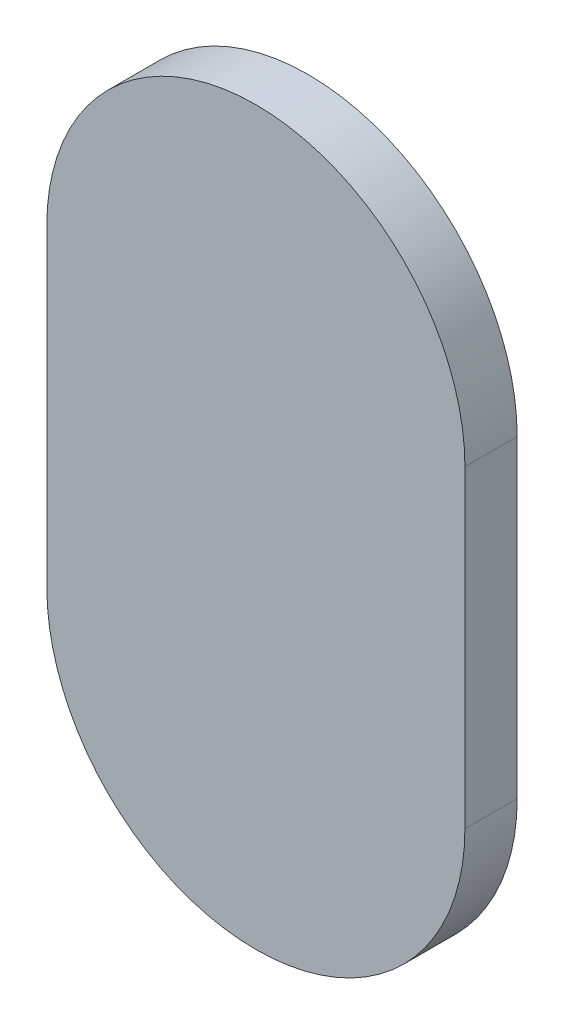
ISO-10303-21;
HEADER;
FILE_DESCRIPTION(('STEP AP214'),'2;1');
FILE_NAME('part.step','',(''),(''),'','','');
FILE_SCHEMA(('AUTOMOTIVE_DESIGN { 1 0 10303 214 1 1 1 1 }'));
ENDSEC;
DATA;
#1=APPLICATION_CONTEXT('core data for automotive mechanical design processes');
#2=APPLICATION_PROTOCOL_DEFINITION('international standard','automotive_design',2000,#1);
#3=PRODUCT_CONTEXT('',#1,'mechanical');
#4=PRODUCT('Part','Part','',(#3));
#5=PRODUCT_RELATED_PRODUCT_CATEGORY('part','',(#4));
#6=PRODUCT_DEFINITION_FORMATION('','',#4);
#7=PRODUCT_DEFINITION_CONTEXT('part definition',#1,'design');
#8=PRODUCT_DEFINITION('design','',#6,#7);
#9=PRODUCT_DEFINITION_SHAPE('','',#8);
#10=(LENGTH_UNIT() NAMED_UNIT(*) SI_UNIT(.MILLI.,.METRE.));
#11=(NAMED_UNIT(*) PLANE_ANGLE_UNIT() SI_UNIT($,.RADIAN.));
#12=(NAMED_UNIT(*) SI_UNIT($,.STERADIAN.) SOLID_ANGLE_UNIT());
#13=UNCERTAINTY_MEASURE_WITH_UNIT(LENGTH_MEASURE(1.E-05),#10,'distance_accuracy_value','');
#14=(GEOMETRIC_REPRESENTATION_CONTEXT(3) GLOBAL_UNCERTAINTY_ASSIGNED_CONTEXT((#13)) GLOBAL_UNIT_ASSIGNED_CONTEXT((#10,
#11,#12)) REPRESENTATION_CONTEXT('',''));
#15=CARTESIAN_POINT('',(0.,0.,0.));
#16=DIRECTION('',(0.,0.,1.));
#17=DIRECTION('',(1.,0.,0.));
#18=AXIS2_PLACEMENT_3D('',#15,#16,#17);
#19=CARTESIAN_POINT('',(0.,0.,0.5));
#20=DIRECTION('',(0.,0.,-1.));
#21=DIRECTION('',(-1.,0.,0.));
#22=AXIS2_PLACEMENT_3D('',#19,#20,#21);
#23=CYLINDRICAL_SURFACE('',#22,2.);
#24=CARTESIAN_POINT('',(0.,0.,0.));
#25=DIRECTION('',(0.,0.,1.));
#26=DIRECTION('',(1.,0.,0.));
#27=AXIS2_PLACEMENT_3D('',#24,#25,#26);
#28=CIRCLE('',#27,2.);
#29=CARTESIAN_POINT('',(2.,0.,0.));
#30=VERTEX_POINT('',#29);
#31=CARTESIAN_POINT('',(-2.,0.,0.));
#32=VERTEX_POINT('',#31);
#33=EDGE_CURVE('E105',#30,#32,#28,.T.);
#34=ORIENTED_EDGE('',*,*,#33,.T.);
#35=DIRECTION('',(0.,0.,-1.));
#36=VECTOR('',#35,1.);
#37=CARTESIAN_POINT('',(-2.,0.,0.5));
#38=LINE('',#37,#36);
#39=CARTESIAN_POINT('',(-2.,0.,0.5));
#40=VERTEX_POINT('',#39);
#41=EDGE_CURVE('E11',#40,#32,#38,.T.);
#42=ORIENTED_EDGE('',*,*,#41,.F.);
#43=CARTESIAN_POINT('',(0.,0.,0.5));
#44=DIRECTION('',(0.,0.,1.));
#45=DIRECTION('',(1.,0.,0.));
#46=AXIS2_PLACEMENT_3D('',#43,#44,#45);
#47=CIRCLE('',#46,2.);
#48=CARTESIAN_POINT('',(2.,0.,0.5));
#49=VERTEX_POINT('',#48);
#50=EDGE_CURVE('E89',#49,#40,#47,.T.);
#51=ORIENTED_EDGE('',*,*,#50,.F.);
#52=DIRECTION('',(0.,0.,-1.));
#53=VECTOR('',#52,1.);
#54=CARTESIAN_POINT('',(2.,0.,0.5));
#55=LINE('',#54,#53);
#56=EDGE_CURVE('E97',#49,#30,#55,.T.);
#57=ORIENTED_EDGE('',*,*,#56,.T.);
#58=EDGE_LOOP('',(#34,#42,#51,#57));
#59=FACE_BOUND('',#58,.T.);
#60=ADVANCED_FACE('F39',(#59),#23,.T.);
#61=CARTESIAN_POINT('',(-2.,0.,0.5));
#62=DIRECTION('',(1.,0.,0.));
#63=DIRECTION('',(0.,1.,0.));
#64=AXIS2_PLACEMENT_3D('',#61,#62,#63);
#65=PLANE('',#64);
#66=DIRECTION('',(0.,-1.,0.));
#67=VECTOR('',#66,1.);
#68=CARTESIAN_POINT('',(-2.,0.,0.));
#69=LINE('',#68,#67);
#70=CARTESIAN_POINT('',(-2.,-3.,0.));
#71=VERTEX_POINT('',#70);
#72=EDGE_CURVE('E92',#32,#71,#69,.T.);
#73=ORIENTED_EDGE('',*,*,#72,.T.);
#74=DIRECTION('',(0.,0.,-1.));
#75=VECTOR('',#74,1.);
#76=CARTESIAN_POINT('',(-2.,-3.,0.5));
#77=LINE('',#76,#75);
#78=CARTESIAN_POINT('',(-2.,-3.,0.5));
#79=VERTEX_POINT('',#78);
#80=EDGE_CURVE('E50',#79,#71,#77,.T.);
#81=ORIENTED_EDGE('',*,*,#80,.F.);
#82=DIRECTION('',(0.,-1.,0.));
#83=VECTOR('',#82,1.);
#84=CARTESIAN_POINT('',(-2.,0.,0.5));
#85=LINE('',#84,#83);
#86=EDGE_CURVE('E82',#40,#79,#85,.T.);
#87=ORIENTED_EDGE('',*,*,#86,.F.);
#88=ORIENTED_EDGE('',*,*,#41,.T.);
#89=EDGE_LOOP('',(#73,#81,#87,#88));
#90=FACE_BOUND('',#89,.T.);
#91=ADVANCED_FACE('F93',(#90),#65,.F.);
#92=CARTESIAN_POINT('',(0.,-3.,0.5));
#93=DIRECTION('',(0.,0.,-1.));
#94=DIRECTION('',(-1.,0.,0.));
#95=AXIS2_PLACEMENT_3D('',#92,#93,#94);
#96=CYLINDRICAL_SURFACE('',#95,2.);
#97=CARTESIAN_POINT('',(0.,-3.,0.));
#98=DIRECTION('',(0.,0.,1.));
#99=DIRECTION('',(1.,0.,0.));
#100=AXIS2_PLACEMENT_3D('',#97,#98,#99);
#101=CIRCLE('',#100,2.);
#102=CARTESIAN_POINT('',(2.,-3.,0.));
#103=VERTEX_POINT('',#102);
#104=EDGE_CURVE('E72',#71,#103,#101,.T.);
#105=ORIENTED_EDGE('',*,*,#104,.T.);
#106=DIRECTION('',(0.,0.,-1.));
#107=VECTOR('',#106,1.);
#108=CARTESIAN_POINT('',(2.,-3.,0.5));
#109=LINE('',#108,#107);
#110=CARTESIAN_POINT('',(2.,-3.,0.5));
#111=VERTEX_POINT('',#110);
#112=EDGE_CURVE('E94',#111,#103,#109,.T.);
#113=ORIENTED_EDGE('',*,*,#112,.F.);
#114=CARTESIAN_POINT('',(0.,-3.,0.5));
#115=DIRECTION('',(0.,0.,1.));
#116=DIRECTION('',(1.,0.,0.));
#117=AXIS2_PLACEMENT_3D('',#114,#115,#116);
#118=CIRCLE('',#117,2.);
#119=EDGE_CURVE('E88',#79,#111,#118,.T.);
#120=ORIENTED_EDGE('',*,*,#119,.F.);
#121=ORIENTED_EDGE('',*,*,#80,.T.);
#122=EDGE_LOOP('',(#105,#113,#120,#121));
#123=FACE_BOUND('',#122,.T.);
#124=ADVANCED_FACE('F96',(#123),#96,.T.);
#125=CARTESIAN_POINT('',(2.,0.,0.5));
#126=DIRECTION('',(-1.,0.,0.));
#127=DIRECTION('',(0.,-1.,0.));
#128=AXIS2_PLACEMENT_3D('',#125,#126,#127);
#129=PLANE('',#128);
#130=DIRECTION('',(0.,1.,0.));
#131=VECTOR('',#130,1.);
#132=CARTESIAN_POINT('',(2.,0.,0.));
#133=LINE('',#132,#131);
#134=EDGE_CURVE('E76',#103,#30,#133,.T.);
#135=ORIENTED_EDGE('',*,*,#134,.T.);
#136=ORIENTED_EDGE('',*,*,#56,.F.);
#137=DIRECTION('',(0.,1.,0.));
#138=VECTOR('',#137,1.);
#139=CARTESIAN_POINT('',(2.,0.,0.5));
#140=LINE('',#139,#138);
#141=EDGE_CURVE('E54',#111,#49,#140,.T.);
#142=ORIENTED_EDGE('',*,*,#141,.F.);
#143=ORIENTED_EDGE('',*,*,#112,.T.);
#144=EDGE_LOOP('',(#135,#136,#142,#143));
#145=FACE_BOUND('',#144,.T.);
#146=ADVANCED_FACE('F108',(#145),#129,.F.);
#147=CARTESIAN_POINT('',(0.,0.,0.5));
#148=DIRECTION('',(0.,0.,1.));
#149=DIRECTION('',(1.,0.,0.));
#150=AXIS2_PLACEMENT_3D('',#147,#148,#149);
#151=PLANE('',#150);
#152=ORIENTED_EDGE('',*,*,#50,.T.);
#153=ORIENTED_EDGE('',*,*,#86,.T.);
#154=ORIENTED_EDGE('',*,*,#119,.T.);
#155=ORIENTED_EDGE('',*,*,#141,.T.);
#156=EDGE_LOOP('',(#152,#153,#154,#155));
#157=FACE_BOUND('',#156,.T.);
#158=ADVANCED_FACE('F86',(#157),#151,.T.);
#159=CARTESIAN_POINT('',(0.,0.,0.));
#160=DIRECTION('',(0.,0.,1.));
#161=DIRECTION('',(1.,0.,0.));
#162=AXIS2_PLACEMENT_3D('',#159,#160,#161);
#163=PLANE('',#162);
#164=ORIENTED_EDGE('',*,*,#33,.F.);
#165=ORIENTED_EDGE('',*,*,#134,.F.);
#166=ORIENTED_EDGE('',*,*,#104,.F.);
#167=ORIENTED_EDGE('',*,*,#72,.F.);
#168=EDGE_LOOP('',(#164,#165,#166,#167));
#169=FACE_BOUND('',#168,.T.);
#170=ADVANCED_FACE('F115',(#169),#163,.F.);
#171=CLOSED_SHELL('',(#60,#91,#124,#146,#158,#170));
#172=MANIFOLD_SOLID_BREP('B2',#171);
#173=ADVANCED_BREP_SHAPE_REPRESENTATION('',(#18,#172),#14);
#174=SHAPE_DEFINITION_REPRESENTATION(#9,#173);
ENDSEC;
END-ISO-10303-21;
